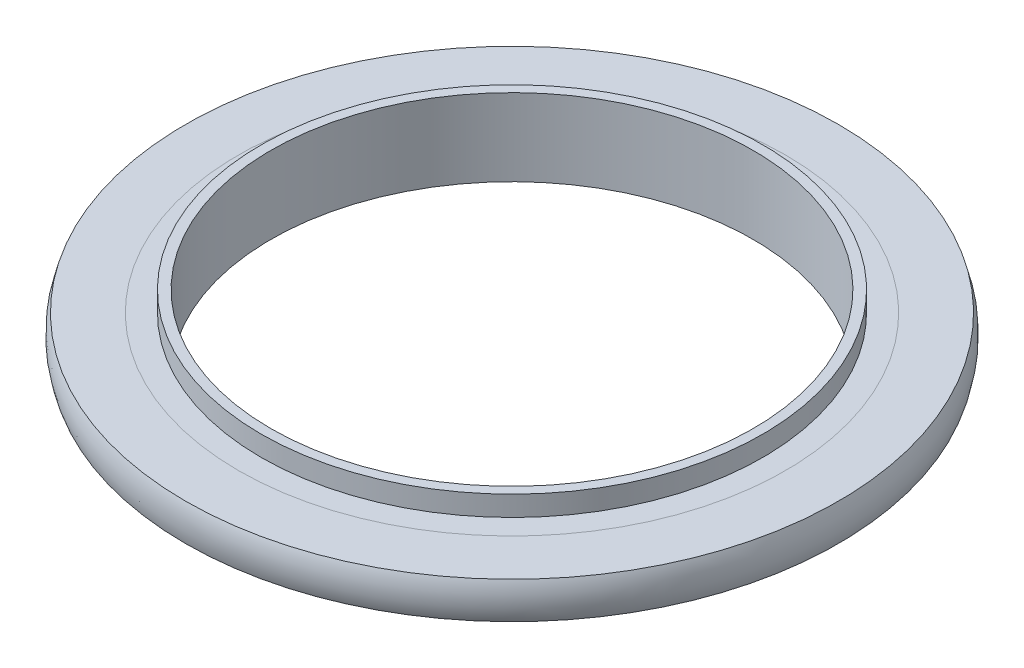
ISO-10303-21;
HEADER;
FILE_DESCRIPTION(('STEP AP214'),'2;1');
FILE_NAME('part.step','',(''),(''),'','','');
FILE_SCHEMA(('AUTOMOTIVE_DESIGN { 1 0 10303 214 1 1 1 1 }'));
ENDSEC;
DATA;
#1=APPLICATION_CONTEXT('core data for automotive mechanical design processes');
#2=APPLICATION_PROTOCOL_DEFINITION('international standard','automotive_design',2000,#1);
#3=PRODUCT_CONTEXT('',#1,'mechanical');
#4=PRODUCT('Part','Part','',(#3));
#5=PRODUCT_RELATED_PRODUCT_CATEGORY('part','',(#4));
#6=PRODUCT_DEFINITION_FORMATION('','',#4);
#7=PRODUCT_DEFINITION_CONTEXT('part definition',#1,'design');
#8=PRODUCT_DEFINITION('design','',#6,#7);
#9=PRODUCT_DEFINITION_SHAPE('','',#8);
#10=(LENGTH_UNIT() NAMED_UNIT(*) SI_UNIT(.MILLI.,.METRE.));
#11=(NAMED_UNIT(*) PLANE_ANGLE_UNIT() SI_UNIT($,.RADIAN.));
#12=(NAMED_UNIT(*) SI_UNIT($,.STERADIAN.) SOLID_ANGLE_UNIT());
#13=UNCERTAINTY_MEASURE_WITH_UNIT(LENGTH_MEASURE(1.E-05),#10,'distance_accuracy_value','');
#14=(GEOMETRIC_REPRESENTATION_CONTEXT(3) GLOBAL_UNCERTAINTY_ASSIGNED_CONTEXT((#13)) GLOBAL_UNIT_ASSIGNED_CONTEXT((#10,
#11,#12)) REPRESENTATION_CONTEXT('',''));
#15=CARTESIAN_POINT('',(0.,0.,0.));
#16=DIRECTION('',(0.,0.,1.));
#17=DIRECTION('',(1.,0.,0.));
#18=AXIS2_PLACEMENT_3D('',#15,#16,#17);
#19=CARTESIAN_POINT('',(0.,0.,0.));
#20=DIRECTION('',(0.,-1.,0.));
#21=DIRECTION('',(0.,0.,-1.));
#22=AXIS2_PLACEMENT_3D('',#19,#20,#21);
#23=TOROIDAL_SURFACE('',#22,33.3,5.3);
#24=CARTESIAN_POINT('',(0.,-1.905,0.));
#25=DIRECTION('',(0.,-1.,0.));
#26=DIRECTION('',(0.,0.,-1.));
#27=AXIS2_PLACEMENT_3D('',#24,#25,#26);
#28=CIRCLE('',#27,28.3541962230594);
#29=CARTESIAN_POINT('',(0.,-1.905,-28.3541962230594));
#30=VERTEX_POINT('',#29);
#31=EDGE_CURVE('E11',#30,#30,#28,.T.);
#32=ORIENTED_EDGE('',*,*,#31,.T.);
#33=EDGE_LOOP('',(#32));
#34=FACE_BOUND('',#33,.T.);
#35=CARTESIAN_POINT('',(0.,1.905,0.));
#36=DIRECTION('',(0.,-1.,0.));
#37=DIRECTION('',(0.,0.,-1.));
#38=AXIS2_PLACEMENT_3D('',#35,#36,#37);
#39=CIRCLE('',#38,28.3541962230594);
#40=CARTESIAN_POINT('',(0.,1.905,-28.3541962230594));
#41=VERTEX_POINT('',#40);
#42=EDGE_CURVE('E58',#41,#41,#39,.T.);
#43=ORIENTED_EDGE('',*,*,#42,.F.);
#44=EDGE_LOOP('',(#43));
#45=FACE_BOUND('',#44,.T.);
#46=ADVANCED_FACE('F44',(#34,#45),#23,.T.);
#47=CARTESIAN_POINT('',(28.3541962230594,-1.905,0.));
#48=DIRECTION('',(0.,-1.,0.));
#49=DIRECTION('',(0.,0.,-1.));
#50=AXIS2_PLACEMENT_3D('',#47,#48,#49);
#51=PLANE('',#50);
#52=CARTESIAN_POINT('',(0.,-1.905,0.));
#53=DIRECTION('',(0.,-1.,0.));
#54=DIRECTION('',(0.,0.,-1.));
#55=AXIS2_PLACEMENT_3D('',#52,#53,#54);
#56=CIRCLE('',#55,33.8458037769406);
#57=CARTESIAN_POINT('',(0.,-1.905,-33.8458037769406));
#58=VERTEX_POINT('',#57);
#59=EDGE_CURVE('E50',#58,#58,#56,.T.);
#60=ORIENTED_EDGE('',*,*,#59,.T.);
#61=EDGE_LOOP('',(#60));
#62=FACE_BOUND('',#61,.T.);
#63=ORIENTED_EDGE('',*,*,#31,.F.);
#64=EDGE_LOOP('',(#63));
#65=FACE_BOUND('',#64,.T.);
#66=ADVANCED_FACE('F68',(#62,#65),#51,.T.);
#67=CARTESIAN_POINT('',(0.,0.,0.));
#68=DIRECTION('',(0.,-1.,0.));
#69=DIRECTION('',(0.,0.,-1.));
#70=AXIS2_PLACEMENT_3D('',#67,#68,#69);
#71=TOROIDAL_SURFACE('',#70,28.9,5.3);
#72=CARTESIAN_POINT('',(0.,1.905,0.));
#73=DIRECTION('',(0.,-1.,0.));
#74=DIRECTION('',(0.,0.,-1.));
#75=AXIS2_PLACEMENT_3D('',#72,#73,#74);
#76=CIRCLE('',#75,33.8458037769406);
#77=CARTESIAN_POINT('',(0.,1.905,-33.8458037769406));
#78=VERTEX_POINT('',#77);
#79=EDGE_CURVE('E54',#78,#78,#76,.T.);
#80=ORIENTED_EDGE('',*,*,#79,.T.);
#81=EDGE_LOOP('',(#80));
#82=FACE_BOUND('',#81,.T.);
#83=ORIENTED_EDGE('',*,*,#59,.F.);
#84=EDGE_LOOP('',(#83));
#85=FACE_BOUND('',#84,.T.);
#86=ADVANCED_FACE('F72',(#82,#85),#71,.T.);
#87=CARTESIAN_POINT('',(28.3541962230594,1.905,0.));
#88=DIRECTION('',(0.,1.,0.));
#89=DIRECTION('',(0.,0.,1.));
#90=AXIS2_PLACEMENT_3D('',#87,#88,#89);
#91=PLANE('',#90);
#92=ORIENTED_EDGE('',*,*,#42,.T.);
#93=EDGE_LOOP('',(#92));
#94=FACE_BOUND('',#93,.T.);
#95=ORIENTED_EDGE('',*,*,#79,.F.);
#96=EDGE_LOOP('',(#95));
#97=FACE_BOUND('',#96,.T.);
#98=ADVANCED_FACE('F64',(#94,#97),#91,.T.);
#99=CLOSED_SHELL('',(#46,#66,#86,#98));
#100=MANIFOLD_SOLID_BREP('B2',#99);
#101=CARTESIAN_POINT('',(25.,4.,0.));
#102=DIRECTION('',(0.,-1.,0.));
#103=DIRECTION('',(0.,0.,-1.));
#104=AXIS2_PLACEMENT_3D('',#101,#102,#103);
#105=PLANE('',#104);
#106=CARTESIAN_POINT('',(0.,4.,0.));
#107=DIRECTION('',(0.,1.,0.));
#108=DIRECTION('',(0.,0.,1.));
#109=AXIS2_PLACEMENT_3D('',#106,#107,#108);
#110=CIRCLE('',#109,25.);
#111=CARTESIAN_POINT('',(0.,4.,25.));
#112=VERTEX_POINT('',#111);
#113=EDGE_CURVE('E43',#112,#112,#110,.T.);
#114=ORIENTED_EDGE('',*,*,#113,.F.);
#115=EDGE_LOOP('',(#114));
#116=FACE_BOUND('',#115,.T.);
#117=CARTESIAN_POINT('',(0.,4.,0.));
#118=DIRECTION('',(0.,1.,0.));
#119=DIRECTION('',(0.,0.,1.));
#120=AXIS2_PLACEMENT_3D('',#117,#118,#119);
#121=CIRCLE('',#120,26.);
#122=CARTESIAN_POINT('',(0.,4.,26.));
#123=VERTEX_POINT('',#122);
#124=EDGE_CURVE('E133',#123,#123,#121,.T.);
#125=ORIENTED_EDGE('',*,*,#124,.T.);
#126=EDGE_LOOP('',(#125));
#127=FACE_BOUND('',#126,.T.);
#128=ADVANCED_FACE('F105',(#116,#127),#105,.F.);
#129=CARTESIAN_POINT('',(0.,4.,0.));
#130=DIRECTION('',(0.,1.,0.));
#131=DIRECTION('',(0.,0.,1.));
#132=AXIS2_PLACEMENT_3D('',#129,#130,#131);
#133=CYLINDRICAL_SURFACE('',#132,25.);
#134=CARTESIAN_POINT('',(0.,-4.,0.));
#135=DIRECTION('',(0.,1.,0.));
#136=DIRECTION('',(0.,0.,1.));
#137=AXIS2_PLACEMENT_3D('',#134,#135,#136);
#138=CIRCLE('',#137,25.);
#139=CARTESIAN_POINT('',(0.,-4.,25.));
#140=VERTEX_POINT('',#139);
#141=EDGE_CURVE('E111',#140,#140,#138,.T.);
#142=ORIENTED_EDGE('',*,*,#141,.F.);
#143=EDGE_LOOP('',(#142));
#144=FACE_BOUND('',#143,.T.);
#145=ORIENTED_EDGE('',*,*,#113,.T.);
#146=EDGE_LOOP('',(#145));
#147=FACE_BOUND('',#146,.T.);
#148=ADVANCED_FACE('F170',(#144,#147),#133,.F.);
#149=CARTESIAN_POINT('',(25.,-4.,0.));
#150=DIRECTION('',(0.,1.,0.));
#151=DIRECTION('',(0.,0.,1.));
#152=AXIS2_PLACEMENT_3D('',#149,#150,#151);
#153=PLANE('',#152);
#154=CARTESIAN_POINT('',(0.,-4.,0.));
#155=DIRECTION('',(0.,1.,0.));
#156=DIRECTION('',(0.,0.,1.));
#157=AXIS2_PLACEMENT_3D('',#154,#155,#156);
#158=CIRCLE('',#157,26.);
#159=CARTESIAN_POINT('',(0.,-4.,26.));
#160=VERTEX_POINT('',#159);
#161=EDGE_CURVE('E115',#160,#160,#158,.T.);
#162=ORIENTED_EDGE('',*,*,#161,.F.);
#163=EDGE_LOOP('',(#162));
#164=FACE_BOUND('',#163,.T.);
#165=ORIENTED_EDGE('',*,*,#141,.T.);
#166=EDGE_LOOP('',(#165));
#167=FACE_BOUND('',#166,.T.);
#168=ADVANCED_FACE('F165',(#164,#167),#153,.F.);
#169=CARTESIAN_POINT('',(0.,4.,0.));
#170=DIRECTION('',(0.,1.,0.));
#171=DIRECTION('',(0.,0.,1.));
#172=AXIS2_PLACEMENT_3D('',#169,#170,#171);
#173=CYLINDRICAL_SURFACE('',#172,26.);
#174=CARTESIAN_POINT('',(0.,-1.905,0.));
#175=DIRECTION('',(0.,1.,0.));
#176=DIRECTION('',(0.,0.,1.));
#177=AXIS2_PLACEMENT_3D('',#174,#175,#176);
#178=CIRCLE('',#177,26.);
#179=CARTESIAN_POINT('',(0.,-1.905,26.));
#180=VERTEX_POINT('',#179);
#181=EDGE_CURVE('E119',#180,#180,#178,.T.);
#182=ORIENTED_EDGE('',*,*,#181,.F.);
#183=EDGE_LOOP('',(#182));
#184=FACE_BOUND('',#183,.T.);
#185=ORIENTED_EDGE('',*,*,#161,.T.);
#186=EDGE_LOOP('',(#185));
#187=FACE_BOUND('',#186,.T.);
#188=ADVANCED_FACE('F159',(#184,#187),#173,.T.);
#189=CARTESIAN_POINT('',(26.,-1.905,0.));
#190=DIRECTION('',(0.,1.,0.));
#191=DIRECTION('',(0.,0.,1.));
#192=AXIS2_PLACEMENT_3D('',#189,#190,#191);
#193=PLANE('',#192);
#194=CARTESIAN_POINT('',(0.,-1.905,0.));
#195=DIRECTION('',(0.,1.,0.));
#196=DIRECTION('',(0.,0.,1.));
#197=AXIS2_PLACEMENT_3D('',#194,#195,#196);
#198=CIRCLE('',#197,28.3541962230594);
#199=CARTESIAN_POINT('',(0.,-1.905,28.3541962230594));
#200=VERTEX_POINT('',#199);
#201=EDGE_CURVE('E124',#200,#200,#198,.T.);
#202=ORIENTED_EDGE('',*,*,#201,.F.);
#203=EDGE_LOOP('',(#202));
#204=FACE_BOUND('',#203,.T.);
#205=ORIENTED_EDGE('',*,*,#181,.T.);
#206=EDGE_LOOP('',(#205));
#207=FACE_BOUND('',#206,.T.);
#208=ADVANCED_FACE('F153',(#204,#207),#193,.F.);
#209=CARTESIAN_POINT('',(0.,0.,0.));
#210=DIRECTION('',(0.,1.,0.));
#211=DIRECTION('',(0.,0.,1.));
#212=AXIS2_PLACEMENT_3D('',#209,#210,#211);
#213=TOROIDAL_SURFACE('',#212,33.3,5.3);
#214=CARTESIAN_POINT('',(0.,1.905,0.));
#215=DIRECTION('',(0.,1.,0.));
#216=DIRECTION('',(0.,0.,1.));
#217=AXIS2_PLACEMENT_3D('',#214,#215,#216);
#218=CIRCLE('',#217,28.3541962230594);
#219=CARTESIAN_POINT('',(0.,1.905,28.3541962230594));
#220=VERTEX_POINT('',#219);
#221=EDGE_CURVE('E127',#220,#220,#218,.T.);
#222=ORIENTED_EDGE('',*,*,#221,.F.);
#223=EDGE_LOOP('',(#222));
#224=FACE_BOUND('',#223,.T.);
#225=ORIENTED_EDGE('',*,*,#201,.T.);
#226=EDGE_LOOP('',(#225));
#227=FACE_BOUND('',#226,.T.);
#228=ADVANCED_FACE('F147',(#224,#227),#213,.F.);
#229=CARTESIAN_POINT('',(26.,1.905,0.));
#230=DIRECTION('',(0.,-1.,0.));
#231=DIRECTION('',(0.,0.,-1.));
#232=AXIS2_PLACEMENT_3D('',#229,#230,#231);
#233=PLANE('',#232);
#234=CARTESIAN_POINT('',(0.,1.905,0.));
#235=DIRECTION('',(0.,1.,0.));
#236=DIRECTION('',(0.,0.,1.));
#237=AXIS2_PLACEMENT_3D('',#234,#235,#236);
#238=CIRCLE('',#237,26.);
#239=CARTESIAN_POINT('',(0.,1.905,26.));
#240=VERTEX_POINT('',#239);
#241=EDGE_CURVE('E130',#240,#240,#238,.T.);
#242=ORIENTED_EDGE('',*,*,#241,.F.);
#243=EDGE_LOOP('',(#242));
#244=FACE_BOUND('',#243,.T.);
#245=ORIENTED_EDGE('',*,*,#221,.T.);
#246=EDGE_LOOP('',(#245));
#247=FACE_BOUND('',#246,.T.);
#248=ADVANCED_FACE('F141',(#244,#247),#233,.F.);
#249=CARTESIAN_POINT('',(0.,4.,0.));
#250=DIRECTION('',(0.,1.,0.));
#251=DIRECTION('',(0.,0.,1.));
#252=AXIS2_PLACEMENT_3D('',#249,#250,#251);
#253=CYLINDRICAL_SURFACE('',#252,26.);
#254=ORIENTED_EDGE('',*,*,#124,.F.);
#255=EDGE_LOOP('',(#254));
#256=FACE_BOUND('',#255,.T.);
#257=ORIENTED_EDGE('',*,*,#241,.T.);
#258=EDGE_LOOP('',(#257));
#259=FACE_BOUND('',#258,.T.);
#260=ADVANCED_FACE('F138',(#256,#259),#253,.T.);
#261=CLOSED_SHELL('',(#128,#148,#168,#188,#208,#228,#248,#260));
#262=MANIFOLD_SOLID_BREP('B6',#261);
#263=ADVANCED_BREP_SHAPE_REPRESENTATION('',(#18,#100,#262),#14);
#264=SHAPE_DEFINITION_REPRESENTATION(#9,#263);
ENDSEC;
END-ISO-10303-21;
